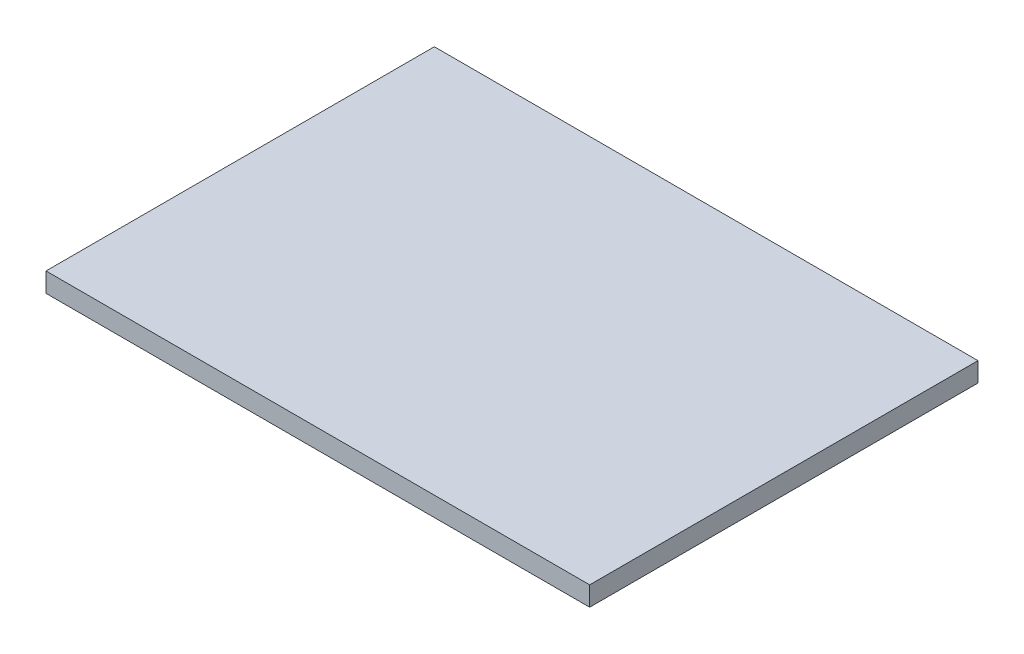
ISO-10303-21;
HEADER;
FILE_DESCRIPTION(('STEP AP214'),'2;1');
FILE_NAME('part.step','',(''),(''),'','','');
FILE_SCHEMA(('AUTOMOTIVE_DESIGN { 1 0 10303 214 1 1 1 1 }'));
ENDSEC;
DATA;
#1=APPLICATION_CONTEXT('core data for automotive mechanical design processes');
#2=APPLICATION_PROTOCOL_DEFINITION('international standard','automotive_design',2000,#1);
#3=PRODUCT_CONTEXT('',#1,'mechanical');
#4=PRODUCT('Part','Part','',(#3));
#5=PRODUCT_RELATED_PRODUCT_CATEGORY('part','',(#4));
#6=PRODUCT_DEFINITION_FORMATION('','',#4);
#7=PRODUCT_DEFINITION_CONTEXT('part definition',#1,'design');
#8=PRODUCT_DEFINITION('design','',#6,#7);
#9=PRODUCT_DEFINITION_SHAPE('','',#8);
#10=(LENGTH_UNIT() NAMED_UNIT(*) SI_UNIT(.MILLI.,.METRE.));
#11=(NAMED_UNIT(*) PLANE_ANGLE_UNIT() SI_UNIT($,.RADIAN.));
#12=(NAMED_UNIT(*) SI_UNIT($,.STERADIAN.) SOLID_ANGLE_UNIT());
#13=UNCERTAINTY_MEASURE_WITH_UNIT(LENGTH_MEASURE(1.E-05),#10,'distance_accuracy_value','');
#14=(GEOMETRIC_REPRESENTATION_CONTEXT(3) GLOBAL_UNCERTAINTY_ASSIGNED_CONTEXT((#13)) GLOBAL_UNIT_ASSIGNED_CONTEXT((#10,
#11,#12)) REPRESENTATION_CONTEXT('',''));
#15=CARTESIAN_POINT('',(0.,0.,0.));
#16=DIRECTION('',(0.,0.,1.));
#17=DIRECTION('',(1.,0.,0.));
#18=AXIS2_PLACEMENT_3D('',#15,#16,#17);
#19=CARTESIAN_POINT('',(-79.3966994499083,25.,-30.7560593432239));
#20=DIRECTION('',(1.,0.,0.));
#21=DIRECTION('',(0.,0.,-1.));
#22=AXIS2_PLACEMENT_3D('',#19,#20,#21);
#23=PLANE('',#22);
#24=DIRECTION('',(0.,0.,1.));
#25=VECTOR('',#24,1.);
#26=CARTESIAN_POINT('',(-79.3966994499083,0.,-30.7560593432239));
#27=LINE('',#26,#25);
#28=CARTESIAN_POINT('',(-79.3966994499083,0.,-30.7560593432239));
#29=VERTEX_POINT('',#28);
#30=CARTESIAN_POINT('',(-79.3966994499083,0.,469.243940656776));
#31=VERTEX_POINT('',#30);
#32=EDGE_CURVE('E96',#29,#31,#27,.T.);
#33=ORIENTED_EDGE('',*,*,#32,.T.);
#34=DIRECTION('',(0.,-1.,0.));
#35=VECTOR('',#34,1.);
#36=CARTESIAN_POINT('',(-79.3966994499083,25.,469.243940656776));
#37=LINE('',#36,#35);
#38=CARTESIAN_POINT('',(-79.3966994499083,25.,469.243940656776));
#39=VERTEX_POINT('',#38);
#40=EDGE_CURVE('E11',#39,#31,#37,.T.);
#41=ORIENTED_EDGE('',*,*,#40,.F.);
#42=DIRECTION('',(0.,0.,1.));
#43=VECTOR('',#42,1.);
#44=CARTESIAN_POINT('',(-79.3966994499083,25.,-30.7560593432239));
#45=LINE('',#44,#43);
#46=CARTESIAN_POINT('',(-79.3966994499083,25.,-30.7560593432239));
#47=VERTEX_POINT('',#46);
#48=EDGE_CURVE('E82',#47,#39,#45,.T.);
#49=ORIENTED_EDGE('',*,*,#48,.F.);
#50=DIRECTION('',(0.,-1.,0.));
#51=VECTOR('',#50,1.);
#52=CARTESIAN_POINT('',(-79.3966994499083,25.,-30.7560593432239));
#53=LINE('',#52,#51);
#54=EDGE_CURVE('E49',#47,#29,#53,.T.);
#55=ORIENTED_EDGE('',*,*,#54,.T.);
#56=EDGE_LOOP('',(#33,#41,#49,#55));
#57=FACE_BOUND('',#56,.T.);
#58=ADVANCED_FACE('F33',(#57),#23,.F.);
#59=CARTESIAN_POINT('',(-79.3966994499083,25.,469.243940656776));
#60=DIRECTION('',(0.,0.,-1.));
#61=DIRECTION('',(-1.,0.,0.));
#62=AXIS2_PLACEMENT_3D('',#59,#60,#61);
#63=PLANE('',#62);
#64=DIRECTION('',(1.,0.,0.));
#65=VECTOR('',#64,1.);
#66=CARTESIAN_POINT('',(-79.3966994499083,0.,469.243940656776));
#67=LINE('',#66,#65);
#68=CARTESIAN_POINT('',(620.603300550092,0.,469.243940656776));
#69=VERTEX_POINT('',#68);
#70=EDGE_CURVE('E87',#31,#69,#67,.T.);
#71=ORIENTED_EDGE('',*,*,#70,.T.);
#72=DIRECTION('',(0.,-1.,0.));
#73=VECTOR('',#72,1.);
#74=CARTESIAN_POINT('',(620.603300550092,25.,469.243940656776));
#75=LINE('',#74,#73);
#76=CARTESIAN_POINT('',(620.603300550092,25.,469.243940656776));
#77=VERTEX_POINT('',#76);
#78=EDGE_CURVE('E41',#77,#69,#75,.T.);
#79=ORIENTED_EDGE('',*,*,#78,.F.);
#80=DIRECTION('',(1.,0.,0.));
#81=VECTOR('',#80,1.);
#82=CARTESIAN_POINT('',(-79.3966994499083,25.,469.243940656776));
#83=LINE('',#82,#81);
#84=EDGE_CURVE('E74',#39,#77,#83,.T.);
#85=ORIENTED_EDGE('',*,*,#84,.F.);
#86=ORIENTED_EDGE('',*,*,#40,.T.);
#87=EDGE_LOOP('',(#71,#79,#85,#86));
#88=FACE_BOUND('',#87,.T.);
#89=ADVANCED_FACE('F86',(#88),#63,.F.);
#90=CARTESIAN_POINT('',(620.603300550092,25.,-30.7560593432239));
#91=DIRECTION('',(1.,0.,0.));
#92=DIRECTION('',(0.,0.,-1.));
#93=AXIS2_PLACEMENT_3D('',#90,#91,#92);
#94=PLANE('',#93);
#95=DIRECTION('',(0.,0.,1.));
#96=VECTOR('',#95,1.);
#97=CARTESIAN_POINT('',(620.603300550092,0.,-30.7560593432239));
#98=LINE('',#97,#96);
#99=CARTESIAN_POINT('',(620.603300550092,0.,-30.7560593432239));
#100=VERTEX_POINT('',#99);
#101=EDGE_CURVE('E99',#100,#69,#98,.T.);
#102=ORIENTED_EDGE('',*,*,#101,.F.);
#103=DIRECTION('',(0.,-1.,0.));
#104=VECTOR('',#103,1.);
#105=CARTESIAN_POINT('',(620.603300550092,25.,-30.7560593432239));
#106=LINE('',#105,#104);
#107=CARTESIAN_POINT('',(620.603300550092,25.,-30.7560593432239));
#108=VERTEX_POINT('',#107);
#109=EDGE_CURVE('E63',#108,#100,#106,.T.);
#110=ORIENTED_EDGE('',*,*,#109,.F.);
#111=DIRECTION('',(0.,0.,1.));
#112=VECTOR('',#111,1.);
#113=CARTESIAN_POINT('',(620.603300550092,25.,-30.7560593432239));
#114=LINE('',#113,#112);
#115=EDGE_CURVE('E81',#108,#77,#114,.T.);
#116=ORIENTED_EDGE('',*,*,#115,.T.);
#117=ORIENTED_EDGE('',*,*,#78,.T.);
#118=EDGE_LOOP('',(#102,#110,#116,#117));
#119=FACE_BOUND('',#118,.T.);
#120=ADVANCED_FACE('F90',(#119),#94,.T.);
#121=CARTESIAN_POINT('',(-79.3966994499083,25.,-30.7560593432239));
#122=DIRECTION('',(0.,0.,-1.));
#123=DIRECTION('',(-1.,0.,0.));
#124=AXIS2_PLACEMENT_3D('',#121,#122,#123);
#125=PLANE('',#124);
#126=DIRECTION('',(1.,0.,0.));
#127=VECTOR('',#126,1.);
#128=CARTESIAN_POINT('',(-79.3966994499083,0.,-30.7560593432239));
#129=LINE('',#128,#127);
#130=EDGE_CURVE('E101',#29,#100,#129,.T.);
#131=ORIENTED_EDGE('',*,*,#130,.F.);
#132=ORIENTED_EDGE('',*,*,#54,.F.);
#133=DIRECTION('',(1.,0.,0.));
#134=VECTOR('',#133,1.);
#135=CARTESIAN_POINT('',(-79.3966994499083,25.,-30.7560593432239));
#136=LINE('',#135,#134);
#137=EDGE_CURVE('E91',#47,#108,#136,.T.);
#138=ORIENTED_EDGE('',*,*,#137,.T.);
#139=ORIENTED_EDGE('',*,*,#109,.T.);
#140=EDGE_LOOP('',(#131,#132,#138,#139));
#141=FACE_BOUND('',#140,.T.);
#142=ADVANCED_FACE('F107',(#141),#125,.T.);
#143=CARTESIAN_POINT('',(0.,25.,0.));
#144=DIRECTION('',(0.,1.,0.));
#145=DIRECTION('',(0.,0.,1.));
#146=AXIS2_PLACEMENT_3D('',#143,#144,#145);
#147=PLANE('',#146);
#148=ORIENTED_EDGE('',*,*,#48,.T.);
#149=ORIENTED_EDGE('',*,*,#84,.T.);
#150=ORIENTED_EDGE('',*,*,#115,.F.);
#151=ORIENTED_EDGE('',*,*,#137,.F.);
#152=EDGE_LOOP('',(#148,#149,#150,#151));
#153=FACE_BOUND('',#152,.T.);
#154=ADVANCED_FACE('F78',(#153),#147,.T.);
#155=CARTESIAN_POINT('',(0.,0.,0.));
#156=DIRECTION('',(0.,1.,0.));
#157=DIRECTION('',(0.,0.,1.));
#158=AXIS2_PLACEMENT_3D('',#155,#156,#157);
#159=PLANE('',#158);
#160=ORIENTED_EDGE('',*,*,#32,.F.);
#161=ORIENTED_EDGE('',*,*,#130,.T.);
#162=ORIENTED_EDGE('',*,*,#101,.T.);
#163=ORIENTED_EDGE('',*,*,#70,.F.);
#164=EDGE_LOOP('',(#160,#161,#162,#163));
#165=FACE_BOUND('',#164,.T.);
#166=ADVANCED_FACE('F106',(#165),#159,.F.);
#167=CLOSED_SHELL('',(#58,#89,#120,#142,#154,#166));
#168=MANIFOLD_SOLID_BREP('B2',#167);
#169=ADVANCED_BREP_SHAPE_REPRESENTATION('',(#18,#168),#14);
#170=SHAPE_DEFINITION_REPRESENTATION(#9,#169);
ENDSEC;
END-ISO-10303-21;
